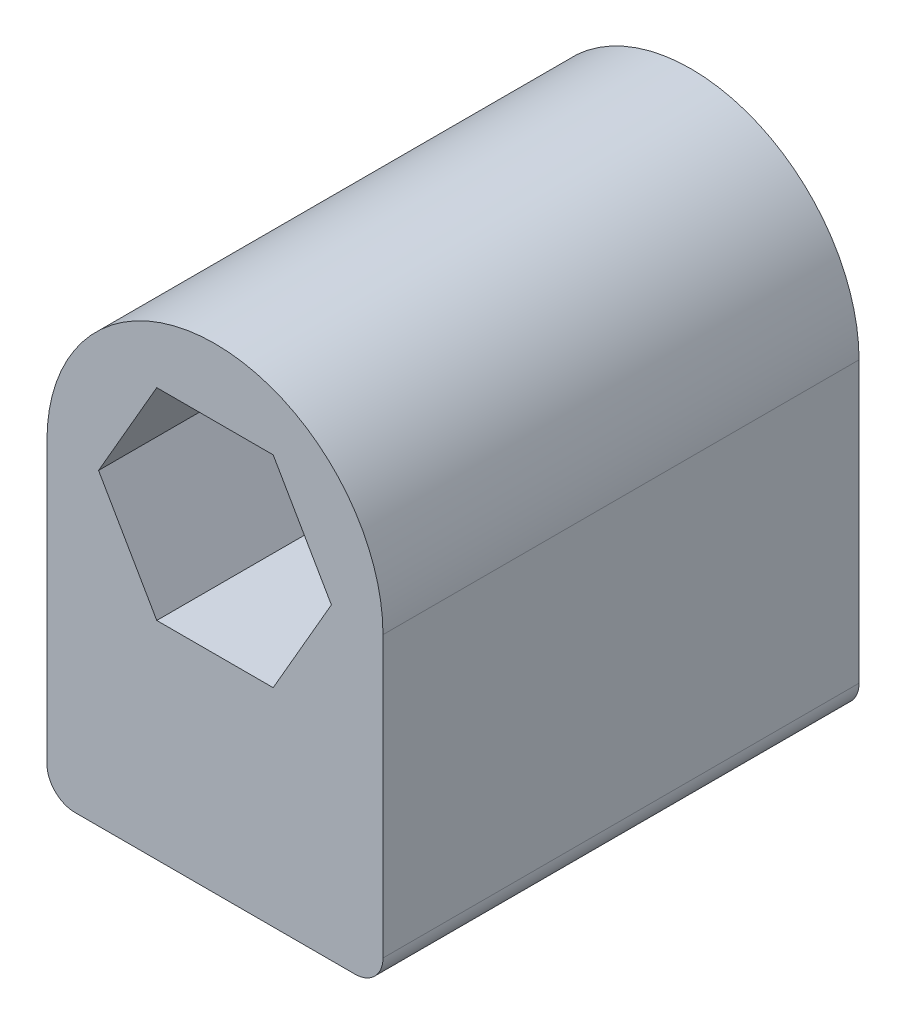
ISO-10303-21;
HEADER;
FILE_DESCRIPTION(('STEP AP214'),'2;1');
FILE_NAME('part.step','',(''),(''),'','','');
FILE_SCHEMA(('AUTOMOTIVE_DESIGN { 1 0 10303 214 1 1 1 1 }'));
ENDSEC;
DATA;
#1=APPLICATION_CONTEXT('core data for automotive mechanical design processes');
#2=APPLICATION_PROTOCOL_DEFINITION('international standard','automotive_design',2000,#1);
#3=PRODUCT_CONTEXT('',#1,'mechanical');
#4=PRODUCT('Part','Part','',(#3));
#5=PRODUCT_RELATED_PRODUCT_CATEGORY('part','',(#4));
#6=PRODUCT_DEFINITION_FORMATION('','',#4);
#7=PRODUCT_DEFINITION_CONTEXT('part definition',#1,'design');
#8=PRODUCT_DEFINITION('design','',#6,#7);
#9=PRODUCT_DEFINITION_SHAPE('','',#8);
#10=(LENGTH_UNIT() NAMED_UNIT(*) SI_UNIT(.MILLI.,.METRE.));
#11=(NAMED_UNIT(*) PLANE_ANGLE_UNIT() SI_UNIT($,.RADIAN.));
#12=(NAMED_UNIT(*) SI_UNIT($,.STERADIAN.) SOLID_ANGLE_UNIT());
#13=UNCERTAINTY_MEASURE_WITH_UNIT(LENGTH_MEASURE(1.E-05),#10,'distance_accuracy_value','');
#14=(GEOMETRIC_REPRESENTATION_CONTEXT(3) GLOBAL_UNCERTAINTY_ASSIGNED_CONTEXT((#13)) GLOBAL_UNIT_ASSIGNED_CONTEXT((#10,
#11,#12)) REPRESENTATION_CONTEXT('',''));
#15=CARTESIAN_POINT('',(0.,0.,0.));
#16=DIRECTION('',(0.,0.,1.));
#17=DIRECTION('',(1.,0.,0.));
#18=AXIS2_PLACEMENT_3D('',#15,#16,#17);
#19=CARTESIAN_POINT('',(11.,1.,17.));
#20=DIRECTION('',(0.,0.,1.));
#21=DIRECTION('',(1.,0.,0.));
#22=AXIS2_PLACEMENT_3D('',#19,#20,#21);
#23=PLANE('',#22);
#24=CARTESIAN_POINT('',(11.,1.,17.));
#25=DIRECTION('',(0.,0.,1.));
#26=DIRECTION('',(1.,0.,0.));
#27=AXIS2_PLACEMENT_3D('',#24,#25,#26);
#28=CIRCLE('',#27,1.);
#29=CARTESIAN_POINT('',(11.,0.,17.));
#30=VERTEX_POINT('',#29);
#31=CARTESIAN_POINT('',(12.,1.00000000000001,17.));
#32=VERTEX_POINT('',#31);
#33=EDGE_CURVE('E198',#30,#32,#28,.T.);
#34=ORIENTED_EDGE('',*,*,#33,.T.);
#35=DIRECTION('',(0.,1.,0.));
#36=VECTOR('',#35,1.);
#37=CARTESIAN_POINT('',(12.,1.00000000000001,17.));
#38=LINE('',#37,#36);
#39=CARTESIAN_POINT('',(12.,11.,17.));
#40=VERTEX_POINT('',#39);
#41=EDGE_CURVE('E202',#32,#40,#38,.T.);
#42=ORIENTED_EDGE('',*,*,#41,.T.);
#43=CARTESIAN_POINT('',(6.,11.,17.));
#44=DIRECTION('',(0.,0.,1.));
#45=DIRECTION('',(1.,0.,0.));
#46=AXIS2_PLACEMENT_3D('',#43,#44,#45);
#47=CIRCLE('',#46,6.);
#48=CARTESIAN_POINT('',(0.,11.,17.));
#49=VERTEX_POINT('',#48);
#50=EDGE_CURVE('E206',#40,#49,#47,.T.);
#51=ORIENTED_EDGE('',*,*,#50,.T.);
#52=DIRECTION('',(0.,-1.,0.));
#53=VECTOR('',#52,1.);
#54=CARTESIAN_POINT('',(0.,1.00000000000001,17.));
#55=LINE('',#54,#53);
#56=CARTESIAN_POINT('',(0.,1.,17.));
#57=VERTEX_POINT('',#56);
#58=EDGE_CURVE('E209',#49,#57,#55,.T.);
#59=ORIENTED_EDGE('',*,*,#58,.T.);
#60=CARTESIAN_POINT('',(1.,1.,17.));
#61=DIRECTION('',(0.,0.,1.));
#62=DIRECTION('',(-1.,0.,0.));
#63=AXIS2_PLACEMENT_3D('',#60,#61,#62);
#64=CIRCLE('',#63,1.);
#65=CARTESIAN_POINT('',(1.00000000000001,0.,17.));
#66=VERTEX_POINT('',#65);
#67=EDGE_CURVE('E212',#57,#66,#64,.T.);
#68=ORIENTED_EDGE('',*,*,#67,.T.);
#69=DIRECTION('',(1.,0.,0.));
#70=VECTOR('',#69,1.);
#71=CARTESIAN_POINT('',(1.00000000000001,0.,17.));
#72=LINE('',#71,#70);
#73=EDGE_CURVE('E215',#66,#30,#72,.T.);
#74=ORIENTED_EDGE('',*,*,#73,.T.);
#75=EDGE_LOOP('',(#34,#42,#51,#59,#68,#74));
#76=FACE_BOUND('',#75,.T.);
#77=DIRECTION('',(-0.5,0.866025403784439,0.));
#78=VECTOR('',#77,1.);
#79=CARTESIAN_POINT('',(10.1569219381653,11.,17.));
#80=LINE('',#79,#78);
#81=CARTESIAN_POINT('',(10.1569219381653,11.,17.));
#82=VERTEX_POINT('',#81);
#83=CARTESIAN_POINT('',(8.07846096908265,14.6,17.));
#84=VERTEX_POINT('',#83);
#85=EDGE_CURVE('E138',#82,#84,#80,.T.);
#86=ORIENTED_EDGE('',*,*,#85,.F.);
#87=DIRECTION('',(0.5,0.866025403784439,0.));
#88=VECTOR('',#87,1.);
#89=CARTESIAN_POINT('',(8.07846096908266,7.4,17.));
#90=LINE('',#89,#88);
#91=CARTESIAN_POINT('',(8.07846096908266,7.4,17.));
#92=VERTEX_POINT('',#91);
#93=EDGE_CURVE('E129',#92,#82,#90,.T.);
#94=ORIENTED_EDGE('',*,*,#93,.F.);
#95=DIRECTION('',(1.,0.,0.));
#96=VECTOR('',#95,1.);
#97=CARTESIAN_POINT('',(3.92153903091735,7.4,17.));
#98=LINE('',#97,#96);
#99=CARTESIAN_POINT('',(3.92153903091735,7.4,17.));
#100=VERTEX_POINT('',#99);
#101=EDGE_CURVE('E164',#100,#92,#98,.T.);
#102=ORIENTED_EDGE('',*,*,#101,.F.);
#103=DIRECTION('',(0.5,-0.866025403784439,0.));
#104=VECTOR('',#103,1.);
#105=CARTESIAN_POINT('',(1.84307806183469,11.,17.));
#106=LINE('',#105,#104);
#107=CARTESIAN_POINT('',(1.84307806183469,11.,17.));
#108=VERTEX_POINT('',#107);
#109=EDGE_CURVE('E161',#108,#100,#106,.T.);
#110=ORIENTED_EDGE('',*,*,#109,.F.);
#111=DIRECTION('',(-0.5,-0.866025403784439,0.));
#112=VECTOR('',#111,1.);
#113=CARTESIAN_POINT('',(3.92153903091735,14.6,17.));
#114=LINE('',#113,#112);
#115=CARTESIAN_POINT('',(3.92153903091735,14.6,17.));
#116=VERTEX_POINT('',#115);
#117=EDGE_CURVE('E156',#116,#108,#114,.T.);
#118=ORIENTED_EDGE('',*,*,#117,.F.);
#119=DIRECTION('',(-1.,0.,0.));
#120=VECTOR('',#119,1.);
#121=CARTESIAN_POINT('',(8.07846096908265,14.6,17.));
#122=LINE('',#121,#120);
#123=EDGE_CURVE('E152',#84,#116,#122,.T.);
#124=ORIENTED_EDGE('',*,*,#123,.F.);
#125=EDGE_LOOP('',(#86,#94,#102,#110,#118,#124));
#126=FACE_BOUND('',#125,.T.);
#127=ADVANCED_FACE('F39',(#76,#126),#23,.T.);
#128=CARTESIAN_POINT('',(11.,1.,0.));
#129=DIRECTION('',(0.,0.,1.));
#130=DIRECTION('',(1.,0.,0.));
#131=AXIS2_PLACEMENT_3D('',#128,#129,#130);
#132=PLANE('',#131);
#133=CARTESIAN_POINT('',(11.,1.,0.));
#134=DIRECTION('',(0.,0.,1.));
#135=DIRECTION('',(1.,0.,0.));
#136=AXIS2_PLACEMENT_3D('',#133,#134,#135);
#137=CIRCLE('',#136,1.);
#138=CARTESIAN_POINT('',(11.,0.,0.));
#139=VERTEX_POINT('',#138);
#140=CARTESIAN_POINT('',(12.,1.00000000000001,0.));
#141=VERTEX_POINT('',#140);
#142=EDGE_CURVE('E147',#139,#141,#137,.T.);
#143=ORIENTED_EDGE('',*,*,#142,.F.);
#144=DIRECTION('',(1.,0.,0.));
#145=VECTOR('',#144,1.);
#146=CARTESIAN_POINT('',(1.00000000000001,0.,0.));
#147=LINE('',#146,#145);
#148=CARTESIAN_POINT('',(1.00000000000001,0.,0.));
#149=VERTEX_POINT('',#148);
#150=EDGE_CURVE('E203',#149,#139,#147,.T.);
#151=ORIENTED_EDGE('',*,*,#150,.F.);
#152=CARTESIAN_POINT('',(1.,1.,0.));
#153=DIRECTION('',(0.,0.,1.));
#154=DIRECTION('',(-1.,0.,0.));
#155=AXIS2_PLACEMENT_3D('',#152,#153,#154);
#156=CIRCLE('',#155,1.);
#157=CARTESIAN_POINT('',(0.,1.,0.));
#158=VERTEX_POINT('',#157);
#159=EDGE_CURVE('E231',#158,#149,#156,.T.);
#160=ORIENTED_EDGE('',*,*,#159,.F.);
#161=DIRECTION('',(0.,-1.,0.));
#162=VECTOR('',#161,1.);
#163=CARTESIAN_POINT('',(0.,1.00000000000001,0.));
#164=LINE('',#163,#162);
#165=CARTESIAN_POINT('',(0.,11.,0.));
#166=VERTEX_POINT('',#165);
#167=EDGE_CURVE('E228',#166,#158,#164,.T.);
#168=ORIENTED_EDGE('',*,*,#167,.F.);
#169=CARTESIAN_POINT('',(6.,11.,0.));
#170=DIRECTION('',(0.,0.,1.));
#171=DIRECTION('',(1.,0.,0.));
#172=AXIS2_PLACEMENT_3D('',#169,#170,#171);
#173=CIRCLE('',#172,6.);
#174=CARTESIAN_POINT('',(12.,11.,0.));
#175=VERTEX_POINT('',#174);
#176=EDGE_CURVE('E225',#175,#166,#173,.T.);
#177=ORIENTED_EDGE('',*,*,#176,.F.);
#178=DIRECTION('',(0.,1.,0.));
#179=VECTOR('',#178,1.);
#180=CARTESIAN_POINT('',(12.,1.00000000000001,0.));
#181=LINE('',#180,#179);
#182=EDGE_CURVE('E222',#141,#175,#181,.T.);
#183=ORIENTED_EDGE('',*,*,#182,.F.);
#184=EDGE_LOOP('',(#143,#151,#160,#168,#177,#183));
#185=FACE_BOUND('',#184,.T.);
#186=DIRECTION('',(0.5,0.866025403784439,0.));
#187=VECTOR('',#186,1.);
#188=CARTESIAN_POINT('',(8.07846096908266,7.4,0.));
#189=LINE('',#188,#187);
#190=CARTESIAN_POINT('',(8.07846096908266,7.4,0.));
#191=VERTEX_POINT('',#190);
#192=CARTESIAN_POINT('',(10.1569219381653,11.,0.));
#193=VERTEX_POINT('',#192);
#194=EDGE_CURVE('E63',#191,#193,#189,.T.);
#195=ORIENTED_EDGE('',*,*,#194,.T.);
#196=DIRECTION('',(-0.5,0.866025403784439,0.));
#197=VECTOR('',#196,1.);
#198=CARTESIAN_POINT('',(10.1569219381653,11.,0.));
#199=LINE('',#198,#197);
#200=CARTESIAN_POINT('',(8.07846096908265,14.6,0.));
#201=VERTEX_POINT('',#200);
#202=EDGE_CURVE('E145',#193,#201,#199,.T.);
#203=ORIENTED_EDGE('',*,*,#202,.T.);
#204=DIRECTION('',(-1.,0.,0.));
#205=VECTOR('',#204,1.);
#206=CARTESIAN_POINT('',(8.07846096908265,14.6,0.));
#207=LINE('',#206,#205);
#208=CARTESIAN_POINT('',(3.92153903091735,14.6,0.));
#209=VERTEX_POINT('',#208);
#210=EDGE_CURVE('E171',#201,#209,#207,.T.);
#211=ORIENTED_EDGE('',*,*,#210,.T.);
#212=DIRECTION('',(-0.5,-0.866025403784439,0.));
#213=VECTOR('',#212,1.);
#214=CARTESIAN_POINT('',(3.92153903091735,14.6,0.));
#215=LINE('',#214,#213);
#216=CARTESIAN_POINT('',(1.84307806183469,11.,0.));
#217=VERTEX_POINT('',#216);
#218=EDGE_CURVE('E175',#209,#217,#215,.T.);
#219=ORIENTED_EDGE('',*,*,#218,.T.);
#220=DIRECTION('',(0.5,-0.866025403784439,0.));
#221=VECTOR('',#220,1.);
#222=CARTESIAN_POINT('',(1.84307806183469,11.,0.));
#223=LINE('',#222,#221);
#224=CARTESIAN_POINT('',(3.92153903091735,7.4,0.));
#225=VERTEX_POINT('',#224);
#226=EDGE_CURVE('E179',#217,#225,#223,.T.);
#227=ORIENTED_EDGE('',*,*,#226,.T.);
#228=DIRECTION('',(1.,0.,0.));
#229=VECTOR('',#228,1.);
#230=CARTESIAN_POINT('',(3.92153903091735,7.4,0.));
#231=LINE('',#230,#229);
#232=EDGE_CURVE('E139',#225,#191,#231,.T.);
#233=ORIENTED_EDGE('',*,*,#232,.T.);
#234=EDGE_LOOP('',(#195,#203,#211,#219,#227,#233));
#235=FACE_BOUND('',#234,.T.);
#236=ADVANCED_FACE('F262',(#185,#235),#132,.F.);
#237=CARTESIAN_POINT('',(11.,1.,17.));
#238=DIRECTION('',(0.,0.,-1.));
#239=DIRECTION('',(-1.,0.,0.));
#240=AXIS2_PLACEMENT_3D('',#237,#238,#239);
#241=CYLINDRICAL_SURFACE('',#240,1.);
#242=ORIENTED_EDGE('',*,*,#142,.T.);
#243=DIRECTION('',(0.,0.,-1.));
#244=VECTOR('',#243,1.);
#245=CARTESIAN_POINT('',(12.,1.00000000000001,17.));
#246=LINE('',#245,#244);
#247=EDGE_CURVE('E11',#32,#141,#246,.T.);
#248=ORIENTED_EDGE('',*,*,#247,.F.);
#249=ORIENTED_EDGE('',*,*,#33,.F.);
#250=DIRECTION('',(0.,0.,-1.));
#251=VECTOR('',#250,1.);
#252=CARTESIAN_POINT('',(11.,0.,17.));
#253=LINE('',#252,#251);
#254=EDGE_CURVE('E218',#30,#139,#253,.T.);
#255=ORIENTED_EDGE('',*,*,#254,.T.);
#256=EDGE_LOOP('',(#242,#248,#249,#255));
#257=FACE_BOUND('',#256,.T.);
#258=ADVANCED_FACE('F41',(#257),#241,.T.);
#259=CARTESIAN_POINT('',(12.,1.00000000000001,17.));
#260=DIRECTION('',(-1.,0.,0.));
#261=DIRECTION('',(0.,0.,1.));
#262=AXIS2_PLACEMENT_3D('',#259,#260,#261);
#263=PLANE('',#262);
#264=ORIENTED_EDGE('',*,*,#182,.T.);
#265=DIRECTION('',(0.,0.,-1.));
#266=VECTOR('',#265,1.);
#267=CARTESIAN_POINT('',(12.,11.,17.));
#268=LINE('',#267,#266);
#269=EDGE_CURVE('E48',#40,#175,#268,.T.);
#270=ORIENTED_EDGE('',*,*,#269,.F.);
#271=ORIENTED_EDGE('',*,*,#41,.F.);
#272=ORIENTED_EDGE('',*,*,#247,.T.);
#273=EDGE_LOOP('',(#264,#270,#271,#272));
#274=FACE_BOUND('',#273,.T.);
#275=ADVANCED_FACE('F279',(#274),#263,.F.);
#276=CARTESIAN_POINT('',(6.,11.,17.));
#277=DIRECTION('',(0.,0.,-1.));
#278=DIRECTION('',(-1.,0.,0.));
#279=AXIS2_PLACEMENT_3D('',#276,#277,#278);
#280=CYLINDRICAL_SURFACE('',#279,6.);
#281=ORIENTED_EDGE('',*,*,#176,.T.);
#282=DIRECTION('',(0.,0.,-1.));
#283=VECTOR('',#282,1.);
#284=CARTESIAN_POINT('',(0.,11.,17.));
#285=LINE('',#284,#283);
#286=EDGE_CURVE('E247',#49,#166,#285,.T.);
#287=ORIENTED_EDGE('',*,*,#286,.F.);
#288=ORIENTED_EDGE('',*,*,#50,.F.);
#289=ORIENTED_EDGE('',*,*,#269,.T.);
#290=EDGE_LOOP('',(#281,#287,#288,#289));
#291=FACE_BOUND('',#290,.T.);
#292=ADVANCED_FACE('F256',(#291),#280,.T.);
#293=CARTESIAN_POINT('',(0.,1.00000000000001,17.));
#294=DIRECTION('',(1.,0.,0.));
#295=DIRECTION('',(0.,0.,-1.));
#296=AXIS2_PLACEMENT_3D('',#293,#294,#295);
#297=PLANE('',#296);
#298=ORIENTED_EDGE('',*,*,#167,.T.);
#299=DIRECTION('',(0.,0.,-1.));
#300=VECTOR('',#299,1.);
#301=CARTESIAN_POINT('',(0.,1.,17.));
#302=LINE('',#301,#300);
#303=EDGE_CURVE('E243',#57,#158,#302,.T.);
#304=ORIENTED_EDGE('',*,*,#303,.F.);
#305=ORIENTED_EDGE('',*,*,#58,.F.);
#306=ORIENTED_EDGE('',*,*,#286,.T.);
#307=EDGE_LOOP('',(#298,#304,#305,#306));
#308=FACE_BOUND('',#307,.T.);
#309=ADVANCED_FACE('F268',(#308),#297,.F.);
#310=CARTESIAN_POINT('',(1.,1.,17.));
#311=DIRECTION('',(0.,0.,-1.));
#312=DIRECTION('',(-1.,0.,0.));
#313=AXIS2_PLACEMENT_3D('',#310,#311,#312);
#314=CYLINDRICAL_SURFACE('',#313,1.);
#315=ORIENTED_EDGE('',*,*,#159,.T.);
#316=DIRECTION('',(0.,0.,-1.));
#317=VECTOR('',#316,1.);
#318=CARTESIAN_POINT('',(1.00000000000001,0.,17.));
#319=LINE('',#318,#317);
#320=EDGE_CURVE('E239',#66,#149,#319,.T.);
#321=ORIENTED_EDGE('',*,*,#320,.F.);
#322=ORIENTED_EDGE('',*,*,#67,.F.);
#323=ORIENTED_EDGE('',*,*,#303,.T.);
#324=EDGE_LOOP('',(#315,#321,#322,#323));
#325=FACE_BOUND('',#324,.T.);
#326=ADVANCED_FACE('F272',(#325),#314,.T.);
#327=CARTESIAN_POINT('',(1.00000000000001,0.,17.));
#328=DIRECTION('',(0.,1.,0.));
#329=DIRECTION('',(0.,0.,1.));
#330=AXIS2_PLACEMENT_3D('',#327,#328,#329);
#331=PLANE('',#330);
#332=ORIENTED_EDGE('',*,*,#150,.T.);
#333=ORIENTED_EDGE('',*,*,#254,.F.);
#334=ORIENTED_EDGE('',*,*,#73,.F.);
#335=ORIENTED_EDGE('',*,*,#320,.T.);
#336=EDGE_LOOP('',(#332,#333,#334,#335));
#337=FACE_BOUND('',#336,.T.);
#338=ADVANCED_FACE('F282',(#337),#331,.F.);
#339=CARTESIAN_POINT('',(8.07846096908266,7.4,17.));
#340=DIRECTION('',(-0.866025403784439,0.5,0.));
#341=DIRECTION('',(-0.5,-0.866025403784439,0.));
#342=AXIS2_PLACEMENT_3D('',#339,#340,#341);
#343=PLANE('',#342);
#344=ORIENTED_EDGE('',*,*,#194,.F.);
#345=DIRECTION('',(0.,0.,-1.));
#346=VECTOR('',#345,1.);
#347=CARTESIAN_POINT('',(8.07846096908266,7.4,17.));
#348=LINE('',#347,#346);
#349=EDGE_CURVE('E133',#92,#191,#348,.T.);
#350=ORIENTED_EDGE('',*,*,#349,.F.);
#351=ORIENTED_EDGE('',*,*,#93,.T.);
#352=DIRECTION('',(0.,0.,-1.));
#353=VECTOR('',#352,1.);
#354=CARTESIAN_POINT('',(10.1569219381653,11.,17.));
#355=LINE('',#354,#353);
#356=EDGE_CURVE('E132',#82,#193,#355,.T.);
#357=ORIENTED_EDGE('',*,*,#356,.T.);
#358=EDGE_LOOP('',(#344,#350,#351,#357));
#359=FACE_BOUND('',#358,.T.);
#360=ADVANCED_FACE('F131',(#359),#343,.T.);
#361=CARTESIAN_POINT('',(10.1569219381653,11.,17.));
#362=DIRECTION('',(-0.866025403784439,-0.5,0.));
#363=DIRECTION('',(0.5,-0.866025403784439,0.));
#364=AXIS2_PLACEMENT_3D('',#361,#362,#363);
#365=PLANE('',#364);
#366=ORIENTED_EDGE('',*,*,#202,.F.);
#367=ORIENTED_EDGE('',*,*,#356,.F.);
#368=ORIENTED_EDGE('',*,*,#85,.T.);
#369=DIRECTION('',(0.,0.,-1.));
#370=VECTOR('',#369,1.);
#371=CARTESIAN_POINT('',(8.07846096908265,14.6,17.));
#372=LINE('',#371,#370);
#373=EDGE_CURVE('E148',#84,#201,#372,.T.);
#374=ORIENTED_EDGE('',*,*,#373,.T.);
#375=EDGE_LOOP('',(#366,#367,#368,#374));
#376=FACE_BOUND('',#375,.T.);
#377=ADVANCED_FACE('F142',(#376),#365,.T.);
#378=CARTESIAN_POINT('',(8.07846096908265,14.6,17.));
#379=DIRECTION('',(0.,-1.,0.));
#380=DIRECTION('',(0.,0.,-1.));
#381=AXIS2_PLACEMENT_3D('',#378,#379,#380);
#382=PLANE('',#381);
#383=ORIENTED_EDGE('',*,*,#210,.F.);
#384=ORIENTED_EDGE('',*,*,#373,.F.);
#385=ORIENTED_EDGE('',*,*,#123,.T.);
#386=DIRECTION('',(0.,0.,-1.));
#387=VECTOR('',#386,1.);
#388=CARTESIAN_POINT('',(3.92153903091735,14.6,17.));
#389=LINE('',#388,#387);
#390=EDGE_CURVE('E193',#116,#209,#389,.T.);
#391=ORIENTED_EDGE('',*,*,#390,.T.);
#392=EDGE_LOOP('',(#383,#384,#385,#391));
#393=FACE_BOUND('',#392,.T.);
#394=ADVANCED_FACE('F300',(#393),#382,.T.);
#395=CARTESIAN_POINT('',(3.92153903091735,14.6,17.));
#396=DIRECTION('',(0.866025403784439,-0.5,0.));
#397=DIRECTION('',(0.5,0.866025403784439,0.));
#398=AXIS2_PLACEMENT_3D('',#395,#396,#397);
#399=PLANE('',#398);
#400=ORIENTED_EDGE('',*,*,#218,.F.);
#401=ORIENTED_EDGE('',*,*,#390,.F.);
#402=ORIENTED_EDGE('',*,*,#117,.T.);
#403=DIRECTION('',(0.,0.,-1.));
#404=VECTOR('',#403,1.);
#405=CARTESIAN_POINT('',(1.84307806183469,11.,17.));
#406=LINE('',#405,#404);
#407=EDGE_CURVE('E190',#108,#217,#406,.T.);
#408=ORIENTED_EDGE('',*,*,#407,.T.);
#409=EDGE_LOOP('',(#400,#401,#402,#408));
#410=FACE_BOUND('',#409,.T.);
#411=ADVANCED_FACE('F303',(#410),#399,.T.);
#412=CARTESIAN_POINT('',(1.84307806183469,11.,17.));
#413=DIRECTION('',(0.866025403784439,0.5,0.));
#414=DIRECTION('',(-0.5,0.866025403784439,0.));
#415=AXIS2_PLACEMENT_3D('',#412,#413,#414);
#416=PLANE('',#415);
#417=ORIENTED_EDGE('',*,*,#226,.F.);
#418=ORIENTED_EDGE('',*,*,#407,.F.);
#419=ORIENTED_EDGE('',*,*,#109,.T.);
#420=DIRECTION('',(0.,0.,-1.));
#421=VECTOR('',#420,1.);
#422=CARTESIAN_POINT('',(3.92153903091735,7.4,17.));
#423=LINE('',#422,#421);
#424=EDGE_CURVE('E55',#100,#225,#423,.T.);
#425=ORIENTED_EDGE('',*,*,#424,.T.);
#426=EDGE_LOOP('',(#417,#418,#419,#425));
#427=FACE_BOUND('',#426,.T.);
#428=ADVANCED_FACE('F307',(#427),#416,.T.);
#429=CARTESIAN_POINT('',(3.92153903091735,7.4,17.));
#430=DIRECTION('',(0.,1.,0.));
#431=DIRECTION('',(0.,0.,1.));
#432=AXIS2_PLACEMENT_3D('',#429,#430,#431);
#433=PLANE('',#432);
#434=ORIENTED_EDGE('',*,*,#232,.F.);
#435=ORIENTED_EDGE('',*,*,#424,.F.);
#436=ORIENTED_EDGE('',*,*,#101,.T.);
#437=ORIENTED_EDGE('',*,*,#349,.T.);
#438=EDGE_LOOP('',(#434,#435,#436,#437));
#439=FACE_BOUND('',#438,.T.);
#440=ADVANCED_FACE('F311',(#439),#433,.T.);
#441=CLOSED_SHELL('',(#127,#236,#258,#275,#292,#309,#326,#338,#360,#377,#394,#411,#428,#440));
#442=MANIFOLD_SOLID_BREP('B2',#441);
#443=ADVANCED_BREP_SHAPE_REPRESENTATION('',(#18,#442),#14);
#444=SHAPE_DEFINITION_REPRESENTATION(#9,#443);
ENDSEC;
END-ISO-10303-21;
